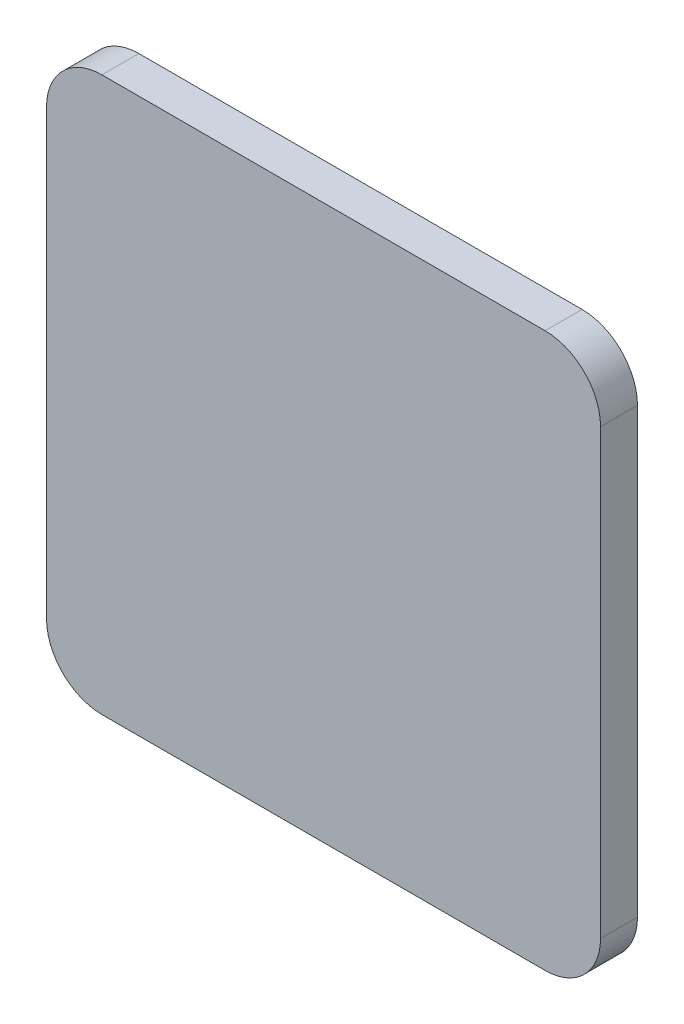
ISO-10303-21;
HEADER;
FILE_DESCRIPTION(('STEP AP214'),'2;1');
FILE_NAME('part.step','',(''),(''),'','','');
FILE_SCHEMA(('AUTOMOTIVE_DESIGN { 1 0 10303 214 1 1 1 1 }'));
ENDSEC;
DATA;
#1=APPLICATION_CONTEXT('core data for automotive mechanical design processes');
#2=APPLICATION_PROTOCOL_DEFINITION('international standard','automotive_design',2000,#1);
#3=PRODUCT_CONTEXT('',#1,'mechanical');
#4=PRODUCT('Part','Part','',(#3));
#5=PRODUCT_RELATED_PRODUCT_CATEGORY('part','',(#4));
#6=PRODUCT_DEFINITION_FORMATION('','',#4);
#7=PRODUCT_DEFINITION_CONTEXT('part definition',#1,'design');
#8=PRODUCT_DEFINITION('design','',#6,#7);
#9=PRODUCT_DEFINITION_SHAPE('','',#8);
#10=(LENGTH_UNIT() NAMED_UNIT(*) SI_UNIT(.MILLI.,.METRE.));
#11=(NAMED_UNIT(*) PLANE_ANGLE_UNIT() SI_UNIT($,.RADIAN.));
#12=(NAMED_UNIT(*) SI_UNIT($,.STERADIAN.) SOLID_ANGLE_UNIT());
#13=UNCERTAINTY_MEASURE_WITH_UNIT(LENGTH_MEASURE(1.E-05),#10,'distance_accuracy_value','');
#14=(GEOMETRIC_REPRESENTATION_CONTEXT(3) GLOBAL_UNCERTAINTY_ASSIGNED_CONTEXT((#13)) GLOBAL_UNIT_ASSIGNED_CONTEXT((#10,
#11,#12)) REPRESENTATION_CONTEXT('',''));
#15=CARTESIAN_POINT('',(0.,0.,0.));
#16=DIRECTION('',(0.,0.,1.));
#17=DIRECTION('',(1.,0.,0.));
#18=AXIS2_PLACEMENT_3D('',#15,#16,#17);
#19=CARTESIAN_POINT('',(-75.,-75.,10.));
#20=DIRECTION('',(1.,0.,0.));
#21=DIRECTION('',(0.,0.,-1.));
#22=AXIS2_PLACEMENT_3D('',#19,#20,#21);
#23=PLANE('',#22);
#24=DIRECTION('',(0.,-1.,0.));
#25=VECTOR('',#24,1.);
#26=CARTESIAN_POINT('',(-75.,-75.,10.));
#27=LINE('',#26,#25);
#28=CARTESIAN_POINT('',(-75.,60.,10.));
#29=VERTEX_POINT('',#28);
#30=CARTESIAN_POINT('',(-75.,-60.,10.));
#31=VERTEX_POINT('',#30);
#32=EDGE_CURVE('E125',#29,#31,#27,.T.);
#33=ORIENTED_EDGE('',*,*,#32,.F.);
#34=DIRECTION('',(0.,0.,-1.));
#35=VECTOR('',#34,1.);
#36=CARTESIAN_POINT('',(-75.,60.,10.));
#37=LINE('',#36,#35);
#38=CARTESIAN_POINT('',(-75.,60.,0.));
#39=VERTEX_POINT('',#38);
#40=EDGE_CURVE('E109',#29,#39,#37,.T.);
#41=ORIENTED_EDGE('',*,*,#40,.T.);
#42=DIRECTION('',(0.,-1.,0.));
#43=VECTOR('',#42,1.);
#44=CARTESIAN_POINT('',(-75.,-75.,0.));
#45=LINE('',#44,#43);
#46=CARTESIAN_POINT('',(-75.,-60.,0.));
#47=VERTEX_POINT('',#46);
#48=EDGE_CURVE('E123',#39,#47,#45,.T.);
#49=ORIENTED_EDGE('',*,*,#48,.T.);
#50=DIRECTION('',(0.,0.,-1.));
#51=VECTOR('',#50,1.);
#52=CARTESIAN_POINT('',(-75.,-60.,10.));
#53=LINE('',#52,#51);
#54=EDGE_CURVE('E128',#47,#31,#53,.F.);
#55=ORIENTED_EDGE('',*,*,#54,.T.);
#56=EDGE_LOOP('',(#33,#41,#49,#55));
#57=FACE_BOUND('',#56,.T.);
#58=ADVANCED_FACE('F39',(#57),#23,.F.);
#59=CARTESIAN_POINT('',(75.,-75.,10.));
#60=DIRECTION('',(0.,1.,0.));
#61=DIRECTION('',(-1.,0.,0.));
#62=AXIS2_PLACEMENT_3D('',#59,#60,#61);
#63=PLANE('',#62);
#64=DIRECTION('',(1.,0.,0.));
#65=VECTOR('',#64,1.);
#66=CARTESIAN_POINT('',(75.,-75.,10.));
#67=LINE('',#66,#65);
#68=CARTESIAN_POINT('',(-60.,-75.,10.));
#69=VERTEX_POINT('',#68);
#70=CARTESIAN_POINT('',(60.,-75.,10.));
#71=VERTEX_POINT('',#70);
#72=EDGE_CURVE('E168',#69,#71,#67,.T.);
#73=ORIENTED_EDGE('',*,*,#72,.F.);
#74=DIRECTION('',(0.,0.,-1.));
#75=VECTOR('',#74,1.);
#76=CARTESIAN_POINT('',(-60.,-75.,10.));
#77=LINE('',#76,#75);
#78=CARTESIAN_POINT('',(-60.,-75.,0.));
#79=VERTEX_POINT('',#78);
#80=EDGE_CURVE('E159',#69,#79,#77,.T.);
#81=ORIENTED_EDGE('',*,*,#80,.T.);
#82=DIRECTION('',(1.,0.,0.));
#83=VECTOR('',#82,1.);
#84=CARTESIAN_POINT('',(75.,-75.,0.));
#85=LINE('',#84,#83);
#86=CARTESIAN_POINT('',(60.,-75.,0.));
#87=VERTEX_POINT('',#86);
#88=EDGE_CURVE('E127',#79,#87,#85,.T.);
#89=ORIENTED_EDGE('',*,*,#88,.T.);
#90=DIRECTION('',(0.,0.,-1.));
#91=VECTOR('',#90,1.);
#92=CARTESIAN_POINT('',(60.,-75.,10.));
#93=LINE('',#92,#91);
#94=EDGE_CURVE('E160',#87,#71,#93,.F.);
#95=ORIENTED_EDGE('',*,*,#94,.T.);
#96=EDGE_LOOP('',(#73,#81,#89,#95));
#97=FACE_BOUND('',#96,.T.);
#98=ADVANCED_FACE('F164',(#97),#63,.F.);
#99=CARTESIAN_POINT('',(75.,-75.,10.));
#100=DIRECTION('',(-1.,0.,0.));
#101=DIRECTION('',(0.,0.,1.));
#102=AXIS2_PLACEMENT_3D('',#99,#100,#101);
#103=PLANE('',#102);
#104=DIRECTION('',(0.,1.,0.));
#105=VECTOR('',#104,1.);
#106=CARTESIAN_POINT('',(75.,-75.,10.));
#107=LINE('',#106,#105);
#108=CARTESIAN_POINT('',(75.,-60.,10.));
#109=VERTEX_POINT('',#108);
#110=CARTESIAN_POINT('',(75.,60.,10.));
#111=VERTEX_POINT('',#110);
#112=EDGE_CURVE('E174',#109,#111,#107,.T.);
#113=ORIENTED_EDGE('',*,*,#112,.F.);
#114=DIRECTION('',(0.,0.,-1.));
#115=VECTOR('',#114,1.);
#116=CARTESIAN_POINT('',(75.,-60.,10.));
#117=LINE('',#116,#115);
#118=CARTESIAN_POINT('',(75.,-60.,0.));
#119=VERTEX_POINT('',#118);
#120=EDGE_CURVE('E11',#109,#119,#117,.T.);
#121=ORIENTED_EDGE('',*,*,#120,.T.);
#122=DIRECTION('',(0.,1.,0.));
#123=VECTOR('',#122,1.);
#124=CARTESIAN_POINT('',(75.,-75.,0.));
#125=LINE('',#124,#123);
#126=CARTESIAN_POINT('',(75.,60.,0.));
#127=VERTEX_POINT('',#126);
#128=EDGE_CURVE('E133',#119,#127,#125,.T.);
#129=ORIENTED_EDGE('',*,*,#128,.T.);
#130=DIRECTION('',(0.,0.,-1.));
#131=VECTOR('',#130,1.);
#132=CARTESIAN_POINT('',(75.,60.,10.));
#133=LINE('',#132,#131);
#134=EDGE_CURVE('E50',#127,#111,#133,.F.);
#135=ORIENTED_EDGE('',*,*,#134,.T.);
#136=EDGE_LOOP('',(#113,#121,#129,#135));
#137=FACE_BOUND('',#136,.T.);
#138=ADVANCED_FACE('F171',(#137),#103,.F.);
#139=CARTESIAN_POINT('',(75.,75.,10.));
#140=DIRECTION('',(0.,-1.,0.));
#141=DIRECTION('',(1.,0.,0.));
#142=AXIS2_PLACEMENT_3D('',#139,#140,#141);
#143=PLANE('',#142);
#144=DIRECTION('',(-1.,0.,0.));
#145=VECTOR('',#144,1.);
#146=CARTESIAN_POINT('',(75.,75.,0.));
#147=LINE('',#146,#145);
#148=CARTESIAN_POINT('',(60.,75.,0.));
#149=VERTEX_POINT('',#148);
#150=CARTESIAN_POINT('',(-60.,75.,0.));
#151=VERTEX_POINT('',#150);
#152=EDGE_CURVE('E139',#149,#151,#147,.T.);
#153=ORIENTED_EDGE('',*,*,#152,.T.);
#154=DIRECTION('',(0.,0.,-1.));
#155=VECTOR('',#154,1.);
#156=CARTESIAN_POINT('',(-60.,75.,10.));
#157=LINE('',#156,#155);
#158=CARTESIAN_POINT('',(-60.,75.,10.));
#159=VERTEX_POINT('',#158);
#160=EDGE_CURVE('E106',#151,#159,#157,.F.);
#161=ORIENTED_EDGE('',*,*,#160,.T.);
#162=DIRECTION('',(-1.,0.,0.));
#163=VECTOR('',#162,1.);
#164=CARTESIAN_POINT('',(75.,75.,10.));
#165=LINE('',#164,#163);
#166=CARTESIAN_POINT('',(60.,75.,10.));
#167=VERTEX_POINT('',#166);
#168=EDGE_CURVE('E136',#167,#159,#165,.T.);
#169=ORIENTED_EDGE('',*,*,#168,.F.);
#170=DIRECTION('',(0.,0.,-1.));
#171=VECTOR('',#170,1.);
#172=CARTESIAN_POINT('',(60.,75.,10.));
#173=LINE('',#172,#171);
#174=EDGE_CURVE('E113',#167,#149,#173,.T.);
#175=ORIENTED_EDGE('',*,*,#174,.T.);
#176=EDGE_LOOP('',(#153,#161,#169,#175));
#177=FACE_BOUND('',#176,.T.);
#178=ADVANCED_FACE('F200',(#177),#143,.F.);
#179=CARTESIAN_POINT('',(0.,0.,10.));
#180=DIRECTION('',(0.,0.,1.));
#181=DIRECTION('',(1.,0.,0.));
#182=AXIS2_PLACEMENT_3D('',#179,#180,#181);
#183=PLANE('',#182);
#184=ORIENTED_EDGE('',*,*,#168,.T.);
#185=CARTESIAN_POINT('',(-60.,60.,10.));
#186=DIRECTION('',(0.,0.,1.));
#187=DIRECTION('',(1.,0.,0.));
#188=AXIS2_PLACEMENT_3D('',#185,#186,#187);
#189=CIRCLE('',#188,15.);
#190=EDGE_CURVE('E151',#159,#29,#189,.T.);
#191=ORIENTED_EDGE('',*,*,#190,.T.);
#192=ORIENTED_EDGE('',*,*,#32,.T.);
#193=CARTESIAN_POINT('',(-60.,-60.,10.));
#194=DIRECTION('',(0.,0.,1.));
#195=DIRECTION('',(1.,0.,0.));
#196=AXIS2_PLACEMENT_3D('',#193,#194,#195);
#197=CIRCLE('',#196,15.);
#198=EDGE_CURVE('E153',#31,#69,#197,.T.);
#199=ORIENTED_EDGE('',*,*,#198,.T.);
#200=ORIENTED_EDGE('',*,*,#72,.T.);
#201=CARTESIAN_POINT('',(60.,-60.,10.));
#202=DIRECTION('',(0.,0.,1.));
#203=DIRECTION('',(1.,0.,0.));
#204=AXIS2_PLACEMENT_3D('',#201,#202,#203);
#205=CIRCLE('',#204,15.);
#206=EDGE_CURVE('E58',#71,#109,#205,.T.);
#207=ORIENTED_EDGE('',*,*,#206,.T.);
#208=ORIENTED_EDGE('',*,*,#112,.T.);
#209=CARTESIAN_POINT('',(60.,60.,10.));
#210=DIRECTION('',(0.,0.,1.));
#211=DIRECTION('',(1.,0.,0.));
#212=AXIS2_PLACEMENT_3D('',#209,#210,#211);
#213=CIRCLE('',#212,15.);
#214=EDGE_CURVE('E148',#111,#167,#213,.T.);
#215=ORIENTED_EDGE('',*,*,#214,.T.);
#216=EDGE_LOOP('',(#184,#191,#192,#199,#200,#207,#208,#215));
#217=FACE_BOUND('',#216,.T.);
#218=ADVANCED_FACE('F177',(#217),#183,.T.);
#219=CARTESIAN_POINT('',(0.,0.,0.));
#220=DIRECTION('',(0.,0.,1.));
#221=DIRECTION('',(1.,0.,0.));
#222=AXIS2_PLACEMENT_3D('',#219,#220,#221);
#223=PLANE('',#222);
#224=ORIENTED_EDGE('',*,*,#48,.F.);
#225=CARTESIAN_POINT('',(-60.,60.,0.));
#226=DIRECTION('',(0.,0.,1.));
#227=DIRECTION('',(1.,0.,0.));
#228=AXIS2_PLACEMENT_3D('',#225,#226,#227);
#229=CIRCLE('',#228,15.);
#230=EDGE_CURVE('E103',#39,#151,#229,.F.);
#231=ORIENTED_EDGE('',*,*,#230,.T.);
#232=ORIENTED_EDGE('',*,*,#152,.F.);
#233=CARTESIAN_POINT('',(60.,60.,0.));
#234=DIRECTION('',(0.,0.,1.));
#235=DIRECTION('',(1.,0.,0.));
#236=AXIS2_PLACEMENT_3D('',#233,#234,#235);
#237=CIRCLE('',#236,15.);
#238=EDGE_CURVE('E124',#149,#127,#237,.F.);
#239=ORIENTED_EDGE('',*,*,#238,.T.);
#240=ORIENTED_EDGE('',*,*,#128,.F.);
#241=CARTESIAN_POINT('',(60.,-60.,0.));
#242=DIRECTION('',(0.,0.,1.));
#243=DIRECTION('',(1.,0.,0.));
#244=AXIS2_PLACEMENT_3D('',#241,#242,#243);
#245=CIRCLE('',#244,15.);
#246=EDGE_CURVE('E143',#119,#87,#245,.F.);
#247=ORIENTED_EDGE('',*,*,#246,.T.);
#248=ORIENTED_EDGE('',*,*,#88,.F.);
#249=CARTESIAN_POINT('',(-60.,-60.,0.));
#250=DIRECTION('',(0.,0.,1.));
#251=DIRECTION('',(1.,0.,0.));
#252=AXIS2_PLACEMENT_3D('',#249,#250,#251);
#253=CIRCLE('',#252,15.);
#254=EDGE_CURVE('E117',#79,#47,#253,.F.);
#255=ORIENTED_EDGE('',*,*,#254,.T.);
#256=EDGE_LOOP('',(#224,#231,#232,#239,#240,#247,#248,#255));
#257=FACE_BOUND('',#256,.T.);
#258=ADVANCED_FACE('F126',(#257),#223,.F.);
#259=CARTESIAN_POINT('',(-60.,60.,10.));
#260=DIRECTION('',(0.,0.,-1.));
#261=DIRECTION('',(-1.,0.,0.));
#262=AXIS2_PLACEMENT_3D('',#259,#260,#261);
#263=CYLINDRICAL_SURFACE('',#262,15.);
#264=ORIENTED_EDGE('',*,*,#190,.F.);
#265=ORIENTED_EDGE('',*,*,#160,.F.);
#266=ORIENTED_EDGE('',*,*,#230,.F.);
#267=ORIENTED_EDGE('',*,*,#40,.F.);
#268=EDGE_LOOP('',(#264,#265,#266,#267));
#269=FACE_BOUND('',#268,.T.);
#270=ADVANCED_FACE('F108',(#269),#263,.T.);
#271=CARTESIAN_POINT('',(-60.,-60.,10.));
#272=DIRECTION('',(0.,0.,-1.));
#273=DIRECTION('',(-1.,0.,0.));
#274=AXIS2_PLACEMENT_3D('',#271,#272,#273);
#275=CYLINDRICAL_SURFACE('',#274,15.);
#276=ORIENTED_EDGE('',*,*,#198,.F.);
#277=ORIENTED_EDGE('',*,*,#54,.F.);
#278=ORIENTED_EDGE('',*,*,#254,.F.);
#279=ORIENTED_EDGE('',*,*,#80,.F.);
#280=EDGE_LOOP('',(#276,#277,#278,#279));
#281=FACE_BOUND('',#280,.T.);
#282=ADVANCED_FACE('F179',(#281),#275,.T.);
#283=CARTESIAN_POINT('',(60.,-60.,10.));
#284=DIRECTION('',(0.,0.,-1.));
#285=DIRECTION('',(-1.,0.,0.));
#286=AXIS2_PLACEMENT_3D('',#283,#284,#285);
#287=CYLINDRICAL_SURFACE('',#286,15.);
#288=ORIENTED_EDGE('',*,*,#206,.F.);
#289=ORIENTED_EDGE('',*,*,#94,.F.);
#290=ORIENTED_EDGE('',*,*,#246,.F.);
#291=ORIENTED_EDGE('',*,*,#120,.F.);
#292=EDGE_LOOP('',(#288,#289,#290,#291));
#293=FACE_BOUND('',#292,.T.);
#294=ADVANCED_FACE('F175',(#293),#287,.T.);
#295=CARTESIAN_POINT('',(60.,60.,10.));
#296=DIRECTION('',(0.,0.,-1.));
#297=DIRECTION('',(-1.,0.,0.));
#298=AXIS2_PLACEMENT_3D('',#295,#296,#297);
#299=CYLINDRICAL_SURFACE('',#298,15.);
#300=ORIENTED_EDGE('',*,*,#214,.F.);
#301=ORIENTED_EDGE('',*,*,#134,.F.);
#302=ORIENTED_EDGE('',*,*,#238,.F.);
#303=ORIENTED_EDGE('',*,*,#174,.F.);
#304=EDGE_LOOP('',(#300,#301,#302,#303));
#305=FACE_BOUND('',#304,.T.);
#306=ADVANCED_FACE('F41',(#305),#299,.T.);
#307=CLOSED_SHELL('',(#58,#98,#138,#178,#218,#258,#270,#282,#294,#306));
#308=MANIFOLD_SOLID_BREP('B2',#307);
#309=ADVANCED_BREP_SHAPE_REPRESENTATION('',(#18,#308),#14);
#310=SHAPE_DEFINITION_REPRESENTATION(#9,#309);
ENDSEC;
END-ISO-10303-21;
